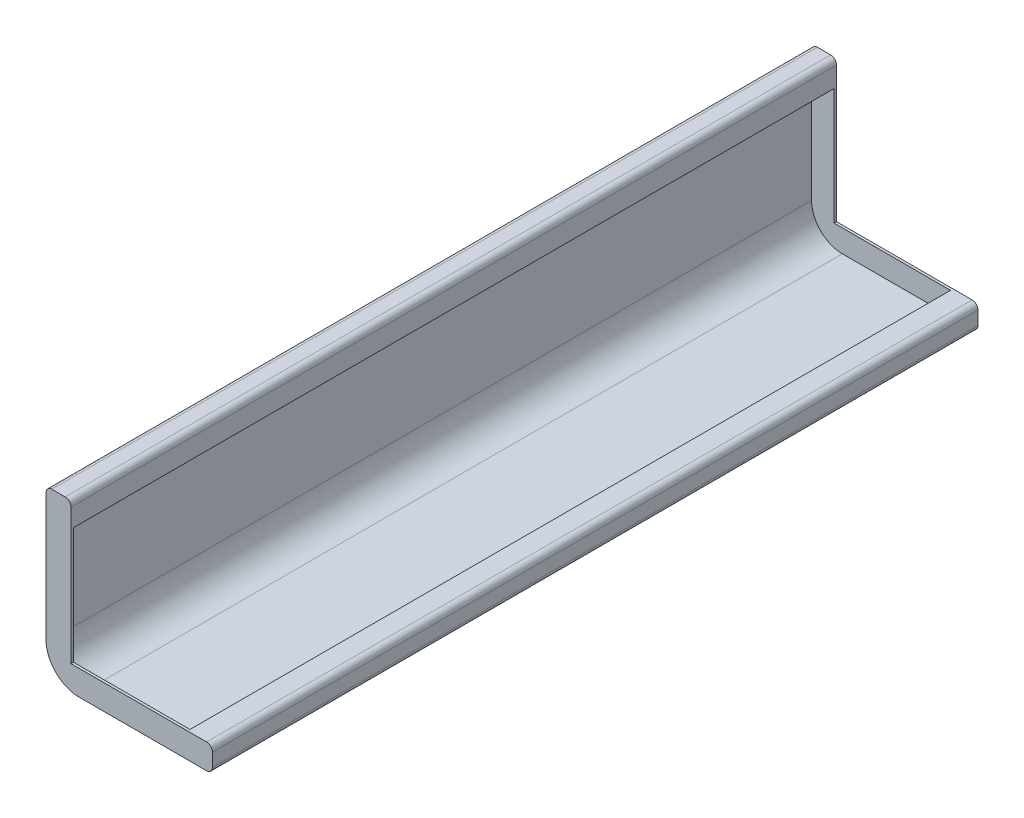
ISO-10303-21;
HEADER;
FILE_DESCRIPTION(('STEP AP214'),'2;1');
FILE_NAME('part.step','',(''),(''),'','','');
FILE_SCHEMA(('AUTOMOTIVE_DESIGN { 1 0 10303 214 1 1 1 1 }'));
ENDSEC;
DATA;
#1=APPLICATION_CONTEXT('core data for automotive mechanical design processes');
#2=APPLICATION_PROTOCOL_DEFINITION('international standard','automotive_design',2000,#1);
#3=PRODUCT_CONTEXT('',#1,'mechanical');
#4=PRODUCT('Part','Part','',(#3));
#5=PRODUCT_RELATED_PRODUCT_CATEGORY('part','',(#4));
#6=PRODUCT_DEFINITION_FORMATION('','',#4);
#7=PRODUCT_DEFINITION_CONTEXT('part definition',#1,'design');
#8=PRODUCT_DEFINITION('design','',#6,#7);
#9=PRODUCT_DEFINITION_SHAPE('','',#8);
#10=(LENGTH_UNIT() NAMED_UNIT(*) SI_UNIT(.MILLI.,.METRE.));
#11=(NAMED_UNIT(*) PLANE_ANGLE_UNIT() SI_UNIT($,.RADIAN.));
#12=(NAMED_UNIT(*) SI_UNIT($,.STERADIAN.) SOLID_ANGLE_UNIT());
#13=UNCERTAINTY_MEASURE_WITH_UNIT(LENGTH_MEASURE(1.E-05),#10,'distance_accuracy_value','');
#14=(GEOMETRIC_REPRESENTATION_CONTEXT(3) GLOBAL_UNCERTAINTY_ASSIGNED_CONTEXT((#13)) GLOBAL_UNIT_ASSIGNED_CONTEXT((#10,
#11,#12)) REPRESENTATION_CONTEXT('',''));
#15=CARTESIAN_POINT('',(0.,0.,0.));
#16=DIRECTION('',(0.,0.,1.));
#17=DIRECTION('',(1.,0.,0.));
#18=AXIS2_PLACEMENT_3D('',#15,#16,#17);
#19=CARTESIAN_POINT('',(-3.08655493139496E-13,98.5000000000002,0.));
#20=DIRECTION('',(0.,-1.,0.));
#21=DIRECTION('',(1.,0.,0.));
#22=AXIS2_PLACEMENT_3D('',#19,#20,#21);
#23=PLANE('',#22);
#24=DIRECTION('',(0.,0.,1.));
#25=VECTOR('',#24,1.);
#26=CARTESIAN_POINT('',(-56.5,98.5,0.));
#27=LINE('',#26,#25);
#28=CARTESIAN_POINT('',(-56.5,98.5,1.5));
#29=VERTEX_POINT('',#28);
#30=CARTESIAN_POINT('',(-56.5,98.5,458.5));
#31=VERTEX_POINT('',#30);
#32=EDGE_CURVE('E433',#29,#31,#27,.T.);
#33=ORIENTED_EDGE('',*,*,#32,.F.);
#34=DIRECTION('',(1.,0.,0.));
#35=VECTOR('',#34,1.);
#36=CARTESIAN_POINT('',(-3.08655493139496E-13,98.5000000000002,1.5));
#37=LINE('',#36,#35);
#38=CARTESIAN_POINT('',(-48.5,98.5,1.5));
#39=VERTEX_POINT('',#38);
#40=EDGE_CURVE('E328',#29,#39,#37,.T.);
#41=ORIENTED_EDGE('',*,*,#40,.T.);
#42=DIRECTION('',(0.,0.,1.));
#43=VECTOR('',#42,1.);
#44=CARTESIAN_POINT('',(-48.5,98.5,460.));
#45=LINE('',#44,#43);
#46=CARTESIAN_POINT('',(-48.5,98.5,458.5));
#47=VERTEX_POINT('',#46);
#48=EDGE_CURVE('E392',#47,#39,#45,.F.);
#49=ORIENTED_EDGE('',*,*,#48,.F.);
#50=DIRECTION('',(-1.,0.,0.));
#51=VECTOR('',#50,1.);
#52=CARTESIAN_POINT('',(-3.08655493139496E-13,98.5000000000002,458.5));
#53=LINE('',#52,#51);
#54=EDGE_CURVE('E363',#47,#31,#53,.T.);
#55=ORIENTED_EDGE('',*,*,#54,.T.);
#56=EDGE_LOOP('',(#33,#41,#49,#55));
#57=FACE_BOUND('',#56,.T.);
#58=ADVANCED_FACE('F119',(#57),#23,.T.);
#59=CARTESIAN_POINT('',(38.5,-1.43917799488446E-13,0.));
#60=DIRECTION('',(-1.,0.,0.));
#61=DIRECTION('',(0.,-1.,0.));
#62=AXIS2_PLACEMENT_3D('',#59,#60,#61);
#63=PLANE('',#62);
#64=DIRECTION('',(0.,0.,-1.));
#65=VECTOR('',#64,1.);
#66=CARTESIAN_POINT('',(38.5,11.5,0.));
#67=LINE('',#66,#65);
#68=CARTESIAN_POINT('',(38.5,11.5,1.5));
#69=VERTEX_POINT('',#68);
#70=CARTESIAN_POINT('',(38.5,11.5,458.5));
#71=VERTEX_POINT('',#70);
#72=EDGE_CURVE('E417',#69,#71,#67,.F.);
#73=ORIENTED_EDGE('',*,*,#72,.F.);
#74=DIRECTION('',(0.,-1.,0.));
#75=VECTOR('',#74,1.);
#76=CARTESIAN_POINT('',(38.5,-1.43917799488446E-13,1.5));
#77=LINE('',#76,#75);
#78=CARTESIAN_POINT('',(38.5,3.50000000000001,1.5));
#79=VERTEX_POINT('',#78);
#80=EDGE_CURVE('E341',#69,#79,#77,.T.);
#81=ORIENTED_EDGE('',*,*,#80,.T.);
#82=DIRECTION('',(0.,0.,-1.));
#83=VECTOR('',#82,1.);
#84=CARTESIAN_POINT('',(38.5,3.5,460.));
#85=LINE('',#84,#83);
#86=CARTESIAN_POINT('',(38.5,3.5,458.5));
#87=VERTEX_POINT('',#86);
#88=EDGE_CURVE('E452',#87,#79,#85,.T.);
#89=ORIENTED_EDGE('',*,*,#88,.F.);
#90=DIRECTION('',(0.,1.,0.));
#91=VECTOR('',#90,1.);
#92=CARTESIAN_POINT('',(38.5,-1.43917799488446E-13,458.5));
#93=LINE('',#92,#91);
#94=EDGE_CURVE('E377',#87,#71,#93,.T.);
#95=ORIENTED_EDGE('',*,*,#94,.T.);
#96=EDGE_LOOP('',(#73,#81,#89,#95));
#97=FACE_BOUND('',#96,.T.);
#98=ADVANCED_FACE('F570',(#97),#63,.T.);
#99=CARTESIAN_POINT('',(-58.5,20.,460.));
#100=DIRECTION('',(-1.,0.,0.));
#101=DIRECTION('',(0.,-1.,0.));
#102=AXIS2_PLACEMENT_3D('',#99,#100,#101);
#103=PLANE('',#102);
#104=DIRECTION('',(0.,-1.,0.));
#105=VECTOR('',#104,1.);
#106=CARTESIAN_POINT('',(-58.5,20.,1.5));
#107=LINE('',#106,#105);
#108=CARTESIAN_POINT('',(-58.5,96.5,1.5));
#109=VERTEX_POINT('',#108);
#110=CARTESIAN_POINT('',(-58.5,20.,1.5));
#111=VERTEX_POINT('',#110);
#112=EDGE_CURVE('E333',#109,#111,#107,.T.);
#113=ORIENTED_EDGE('',*,*,#112,.F.);
#114=DIRECTION('',(0.,0.,1.));
#115=VECTOR('',#114,1.);
#116=CARTESIAN_POINT('',(-58.5,96.5,460.));
#117=LINE('',#116,#115);
#118=CARTESIAN_POINT('',(-58.5,96.5,458.5));
#119=VERTEX_POINT('',#118);
#120=EDGE_CURVE('E440',#119,#109,#117,.F.);
#121=ORIENTED_EDGE('',*,*,#120,.F.);
#122=DIRECTION('',(0.,1.,0.));
#123=VECTOR('',#122,1.);
#124=CARTESIAN_POINT('',(-58.5,20.,458.5));
#125=LINE('',#124,#123);
#126=CARTESIAN_POINT('',(-58.5,20.,458.5));
#127=VERTEX_POINT('',#126);
#128=EDGE_CURVE('E142',#127,#119,#125,.T.);
#129=ORIENTED_EDGE('',*,*,#128,.F.);
#130=DIRECTION('',(0.,0.,-1.));
#131=VECTOR('',#130,1.);
#132=CARTESIAN_POINT('',(-58.5,20.,460.));
#133=LINE('',#132,#131);
#134=EDGE_CURVE('E486',#127,#111,#133,.T.);
#135=ORIENTED_EDGE('',*,*,#134,.T.);
#136=EDGE_LOOP('',(#113,#121,#129,#135));
#137=FACE_BOUND('',#136,.T.);
#138=ADVANCED_FACE('F555',(#137),#103,.F.);
#139=CARTESIAN_POINT('',(-40.,1.5,460.));
#140=DIRECTION('',(0.,-1.,0.));
#141=DIRECTION('',(0.,0.,-1.));
#142=AXIS2_PLACEMENT_3D('',#139,#140,#141);
#143=PLANE('',#142);
#144=DIRECTION('',(1.,0.,0.));
#145=VECTOR('',#144,1.);
#146=CARTESIAN_POINT('',(-40.,1.5,1.5));
#147=LINE('',#146,#145);
#148=CARTESIAN_POINT('',(-40.,1.5,1.5));
#149=VERTEX_POINT('',#148);
#150=CARTESIAN_POINT('',(36.5,1.5,1.5));
#151=VERTEX_POINT('',#150);
#152=EDGE_CURVE('E337',#149,#151,#147,.T.);
#153=ORIENTED_EDGE('',*,*,#152,.F.);
#154=DIRECTION('',(0.,0.,-1.));
#155=VECTOR('',#154,1.);
#156=CARTESIAN_POINT('',(-40.,1.5,460.));
#157=LINE('',#156,#155);
#158=CARTESIAN_POINT('',(-40.,1.5,458.5));
#159=VERTEX_POINT('',#158);
#160=EDGE_CURVE('E495',#159,#149,#157,.T.);
#161=ORIENTED_EDGE('',*,*,#160,.F.);
#162=DIRECTION('',(-1.,0.,0.));
#163=VECTOR('',#162,1.);
#164=CARTESIAN_POINT('',(-40.,1.5,458.5));
#165=LINE('',#164,#163);
#166=CARTESIAN_POINT('',(36.5,1.49999999999998,458.5));
#167=VERTEX_POINT('',#166);
#168=EDGE_CURVE('E371',#167,#159,#165,.T.);
#169=ORIENTED_EDGE('',*,*,#168,.F.);
#170=DIRECTION('',(0.,0.,-1.));
#171=VECTOR('',#170,1.);
#172=CARTESIAN_POINT('',(36.5,1.50000000000003,0.));
#173=LINE('',#172,#171);
#174=EDGE_CURVE('E459',#151,#167,#173,.F.);
#175=ORIENTED_EDGE('',*,*,#174,.F.);
#176=EDGE_LOOP('',(#153,#161,#169,#175));
#177=FACE_BOUND('',#176,.T.);
#178=ADVANCED_FACE('F561',(#177),#143,.F.);
#179=CARTESIAN_POINT('',(-40.,20.,460.));
#180=DIRECTION('',(0.,0.,-1.));
#181=DIRECTION('',(-1.,0.,0.));
#182=AXIS2_PLACEMENT_3D('',#179,#180,#181);
#183=CYLINDRICAL_SURFACE('',#182,18.5);
#184=CARTESIAN_POINT('',(-40.,20.,1.5));
#185=DIRECTION('',(0.,0.,-1.));
#186=DIRECTION('',(-1.,0.,0.));
#187=AXIS2_PLACEMENT_3D('',#184,#185,#186);
#188=CIRCLE('',#187,18.5);
#189=EDGE_CURVE('E335',#111,#149,#188,.F.);
#190=ORIENTED_EDGE('',*,*,#189,.F.);
#191=ORIENTED_EDGE('',*,*,#134,.F.);
#192=CARTESIAN_POINT('',(-40.,20.,458.5));
#193=DIRECTION('',(0.,0.,1.));
#194=DIRECTION('',(1.,0.,0.));
#195=AXIS2_PLACEMENT_3D('',#192,#193,#194);
#196=CIRCLE('',#195,18.5);
#197=EDGE_CURVE('E134',#159,#127,#196,.F.);
#198=ORIENTED_EDGE('',*,*,#197,.F.);
#199=ORIENTED_EDGE('',*,*,#160,.T.);
#200=EDGE_LOOP('',(#190,#191,#198,#199));
#201=FACE_BOUND('',#200,.T.);
#202=ADVANCED_FACE('F558',(#201),#183,.F.);
#203=CARTESIAN_POINT('',(36.5,3.50000000000004,0.));
#204=DIRECTION('',(0.,0.,-1.));
#205=DIRECTION('',(1.,0.,0.));
#206=AXIS2_PLACEMENT_3D('',#203,#204,#205);
#207=CYLINDRICAL_SURFACE('',#206,2.);
#208=CARTESIAN_POINT('',(36.5,3.50000000000004,1.5));
#209=DIRECTION('',(0.,0.,-1.));
#210=DIRECTION('',(-1.,0.,0.));
#211=AXIS2_PLACEMENT_3D('',#208,#209,#210);
#212=CIRCLE('',#211,2.);
#213=EDGE_CURVE('E339',#151,#79,#212,.F.);
#214=ORIENTED_EDGE('',*,*,#213,.F.);
#215=ORIENTED_EDGE('',*,*,#174,.T.);
#216=CARTESIAN_POINT('',(36.5,3.49999999999999,458.5));
#217=DIRECTION('',(0.,0.,1.));
#218=DIRECTION('',(1.,0.,0.));
#219=AXIS2_PLACEMENT_3D('',#216,#217,#218);
#220=CIRCLE('',#219,2.);
#221=EDGE_CURVE('E374',#87,#167,#220,.F.);
#222=ORIENTED_EDGE('',*,*,#221,.F.);
#223=ORIENTED_EDGE('',*,*,#88,.T.);
#224=EDGE_LOOP('',(#214,#215,#222,#223));
#225=FACE_BOUND('',#224,.T.);
#226=ADVANCED_FACE('F567',(#225),#207,.F.);
#227=CARTESIAN_POINT('',(-56.5,96.5,460.));
#228=DIRECTION('',(0.,0.,1.));
#229=DIRECTION('',(0.,1.,0.));
#230=AXIS2_PLACEMENT_3D('',#227,#228,#229);
#231=CYLINDRICAL_SURFACE('',#230,2.);
#232=CARTESIAN_POINT('',(-56.5,96.5,1.5));
#233=DIRECTION('',(0.,0.,-1.));
#234=DIRECTION('',(-1.,0.,0.));
#235=AXIS2_PLACEMENT_3D('',#232,#233,#234);
#236=CIRCLE('',#235,2.);
#237=EDGE_CURVE('E331',#29,#109,#236,.F.);
#238=ORIENTED_EDGE('',*,*,#237,.F.);
#239=ORIENTED_EDGE('',*,*,#32,.T.);
#240=CARTESIAN_POINT('',(-56.5,96.5,458.5));
#241=DIRECTION('',(0.,0.,1.));
#242=DIRECTION('',(1.,0.,0.));
#243=AXIS2_PLACEMENT_3D('',#240,#241,#242);
#244=CIRCLE('',#243,2.);
#245=EDGE_CURVE('E366',#119,#31,#244,.F.);
#246=ORIENTED_EDGE('',*,*,#245,.F.);
#247=ORIENTED_EDGE('',*,*,#120,.T.);
#248=EDGE_LOOP('',(#238,#239,#246,#247));
#249=FACE_BOUND('',#248,.T.);
#250=ADVANCED_FACE('F553',(#249),#231,.F.);
#251=CARTESIAN_POINT('',(36.5,11.5,0.));
#252=DIRECTION('',(0.,0.,-1.));
#253=DIRECTION('',(0.,1.,0.));
#254=AXIS2_PLACEMENT_3D('',#251,#252,#253);
#255=CYLINDRICAL_SURFACE('',#254,2.);
#256=CARTESIAN_POINT('',(36.5,11.5,1.5));
#257=DIRECTION('',(0.,0.,-1.));
#258=DIRECTION('',(-1.,0.,0.));
#259=AXIS2_PLACEMENT_3D('',#256,#257,#258);
#260=CIRCLE('',#259,2.);
#261=CARTESIAN_POINT('',(36.5,13.5,1.5));
#262=VERTEX_POINT('',#261);
#263=EDGE_CURVE('E344',#69,#262,#260,.F.);
#264=ORIENTED_EDGE('',*,*,#263,.F.);
#265=ORIENTED_EDGE('',*,*,#72,.T.);
#266=CARTESIAN_POINT('',(36.5,11.5,458.5));
#267=DIRECTION('',(0.,0.,1.));
#268=DIRECTION('',(1.,0.,0.));
#269=AXIS2_PLACEMENT_3D('',#266,#267,#268);
#270=CIRCLE('',#269,2.);
#271=CARTESIAN_POINT('',(36.5,13.5,458.5));
#272=VERTEX_POINT('',#271);
#273=EDGE_CURVE('E380',#272,#71,#270,.F.);
#274=ORIENTED_EDGE('',*,*,#273,.F.);
#275=DIRECTION('',(0.,0.,-1.));
#276=VECTOR('',#275,1.);
#277=CARTESIAN_POINT('',(36.5,13.5,460.));
#278=LINE('',#277,#276);
#279=EDGE_CURVE('E409',#272,#262,#278,.T.);
#280=ORIENTED_EDGE('',*,*,#279,.T.);
#281=EDGE_LOOP('',(#264,#265,#274,#280));
#282=FACE_BOUND('',#281,.T.);
#283=ADVANCED_FACE('F573',(#282),#255,.F.);
#284=CARTESIAN_POINT('',(1.00613961606657E-13,13.5000000000003,0.));
#285=DIRECTION('',(0.,-1.,0.));
#286=DIRECTION('',(1.,0.,0.));
#287=AXIS2_PLACEMENT_3D('',#284,#285,#286);
#288=PLANE('',#287);
#289=DIRECTION('',(0.,0.,-1.));
#290=VECTOR('',#289,1.);
#291=CARTESIAN_POINT('',(25.,13.5000000000001,460.));
#292=LINE('',#291,#290);
#293=CARTESIAN_POINT('',(25.,13.5000000000001,1.5));
#294=VERTEX_POINT('',#293);
#295=CARTESIAN_POINT('',(25.,13.5000000000001,458.5));
#296=VERTEX_POINT('',#295);
#297=EDGE_CURVE('E421',#294,#296,#292,.F.);
#298=ORIENTED_EDGE('',*,*,#297,.F.);
#299=DIRECTION('',(1.,0.,0.));
#300=VECTOR('',#299,1.);
#301=CARTESIAN_POINT('',(1.00613961606657E-13,13.5000000000003,1.5));
#302=LINE('',#301,#300);
#303=EDGE_CURVE('E346',#294,#262,#302,.T.);
#304=ORIENTED_EDGE('',*,*,#303,.T.);
#305=ORIENTED_EDGE('',*,*,#279,.F.);
#306=DIRECTION('',(-1.,0.,0.));
#307=VECTOR('',#306,1.);
#308=CARTESIAN_POINT('',(1.00613961606657E-13,13.5000000000003,458.5));
#309=LINE('',#308,#307);
#310=EDGE_CURVE('E383',#272,#296,#309,.T.);
#311=ORIENTED_EDGE('',*,*,#310,.T.);
#312=EDGE_LOOP('',(#298,#304,#305,#311));
#313=FACE_BOUND('',#312,.T.);
#314=ADVANCED_FACE('F578',(#313),#288,.T.);
#315=CARTESIAN_POINT('',(25.,15.0000000000001,460.));
#316=DIRECTION('',(1.,0.,0.));
#317=DIRECTION('',(0.,1.,0.));
#318=AXIS2_PLACEMENT_3D('',#315,#316,#317);
#319=PLANE('',#318);
#320=DIRECTION('',(0.,1.,0.));
#321=VECTOR('',#320,1.);
#322=CARTESIAN_POINT('',(25.,15.0000000000001,1.5));
#323=LINE('',#322,#321);
#324=CARTESIAN_POINT('',(25.,15.0000000000001,1.5));
#325=VERTEX_POINT('',#324);
#326=EDGE_CURVE('E310',#294,#325,#323,.T.);
#327=ORIENTED_EDGE('',*,*,#326,.F.);
#328=ORIENTED_EDGE('',*,*,#297,.T.);
#329=DIRECTION('',(0.,-1.,0.));
#330=VECTOR('',#329,1.);
#331=CARTESIAN_POINT('',(25.,15.0000000000001,458.5));
#332=LINE('',#331,#330);
#333=CARTESIAN_POINT('',(25.,15.0000000000001,458.5));
#334=VERTEX_POINT('',#333);
#335=EDGE_CURVE('E386',#334,#296,#332,.T.);
#336=ORIENTED_EDGE('',*,*,#335,.F.);
#337=DIRECTION('',(0.,0.,1.));
#338=VECTOR('',#337,1.);
#339=CARTESIAN_POINT('',(25.,15.0000000000001,0.));
#340=LINE('',#339,#338);
#341=EDGE_CURVE('E418',#325,#334,#340,.T.);
#342=ORIENTED_EDGE('',*,*,#341,.F.);
#343=EDGE_LOOP('',(#327,#328,#336,#342));
#344=FACE_BOUND('',#343,.T.);
#345=ADVANCED_FACE('F581',(#344),#319,.F.);
#346=CARTESIAN_POINT('',(-48.5,96.5,460.));
#347=DIRECTION('',(0.,0.,1.));
#348=DIRECTION('',(1.,0.,0.));
#349=AXIS2_PLACEMENT_3D('',#346,#347,#348);
#350=CYLINDRICAL_SURFACE('',#349,2.);
#351=CARTESIAN_POINT('',(-48.5,96.5,1.5));
#352=DIRECTION('',(0.,0.,-1.));
#353=DIRECTION('',(-1.,0.,0.));
#354=AXIS2_PLACEMENT_3D('',#351,#352,#353);
#355=CIRCLE('',#354,2.);
#356=CARTESIAN_POINT('',(-46.5,96.5,1.5));
#357=VERTEX_POINT('',#356);
#358=EDGE_CURVE('E326',#357,#39,#355,.F.);
#359=ORIENTED_EDGE('',*,*,#358,.F.);
#360=DIRECTION('',(0.,0.,1.));
#361=VECTOR('',#360,1.);
#362=CARTESIAN_POINT('',(-46.5,96.5,0.));
#363=LINE('',#362,#361);
#364=CARTESIAN_POINT('',(-46.5,96.5,458.5));
#365=VERTEX_POINT('',#364);
#366=EDGE_CURVE('E389',#357,#365,#363,.T.);
#367=ORIENTED_EDGE('',*,*,#366,.T.);
#368=CARTESIAN_POINT('',(-48.5,96.5,458.5));
#369=DIRECTION('',(0.,0.,1.));
#370=DIRECTION('',(1.,0.,0.));
#371=AXIS2_PLACEMENT_3D('',#368,#369,#370);
#372=CIRCLE('',#371,2.);
#373=EDGE_CURVE('E360',#47,#365,#372,.F.);
#374=ORIENTED_EDGE('',*,*,#373,.F.);
#375=ORIENTED_EDGE('',*,*,#48,.T.);
#376=EDGE_LOOP('',(#359,#367,#374,#375));
#377=FACE_BOUND('',#376,.T.);
#378=ADVANCED_FACE('F546',(#377),#350,.F.);
#379=CARTESIAN_POINT('',(-46.4999999999993,-3.05311331771914E-13,0.));
#380=DIRECTION('',(-1.,0.,0.));
#381=DIRECTION('',(0.,-1.,0.));
#382=AXIS2_PLACEMENT_3D('',#379,#380,#381);
#383=PLANE('',#382);
#384=ORIENTED_EDGE('',*,*,#366,.F.);
#385=DIRECTION('',(0.,-1.,0.));
#386=VECTOR('',#385,1.);
#387=CARTESIAN_POINT('',(-46.4999999999993,-3.05311331771914E-13,1.5));
#388=LINE('',#387,#386);
#389=CARTESIAN_POINT('',(-46.4999999999999,85.,1.5));
#390=VERTEX_POINT('',#389);
#391=EDGE_CURVE('E321',#357,#390,#388,.T.);
#392=ORIENTED_EDGE('',*,*,#391,.T.);
#393=DIRECTION('',(0.,0.,1.));
#394=VECTOR('',#393,1.);
#395=CARTESIAN_POINT('',(-46.4999999999999,85.,0.));
#396=LINE('',#395,#394);
#397=CARTESIAN_POINT('',(-46.4999999999999,85.,458.5));
#398=VERTEX_POINT('',#397);
#399=EDGE_CURVE('E397',#398,#390,#396,.F.);
#400=ORIENTED_EDGE('',*,*,#399,.F.);
#401=DIRECTION('',(0.,1.,0.));
#402=VECTOR('',#401,1.);
#403=CARTESIAN_POINT('',(-46.4999999999993,-3.05311331771914E-13,458.5));
#404=LINE('',#403,#402);
#405=EDGE_CURVE('E357',#398,#365,#404,.T.);
#406=ORIENTED_EDGE('',*,*,#405,.T.);
#407=EDGE_LOOP('',(#384,#392,#400,#406));
#408=FACE_BOUND('',#407,.T.);
#409=ADVANCED_FACE('F543',(#408),#383,.T.);
#410=CARTESIAN_POINT('',(-44.9999999999999,85.0000000000001,0.));
#411=DIRECTION('',(0.,1.,0.));
#412=DIRECTION('',(-1.,0.,0.));
#413=AXIS2_PLACEMENT_3D('',#410,#411,#412);
#414=PLANE('',#413);
#415=DIRECTION('',(-1.,0.,0.));
#416=VECTOR('',#415,1.);
#417=CARTESIAN_POINT('',(-44.9999999999999,85.0000000000001,1.5));
#418=LINE('',#417,#416);
#419=CARTESIAN_POINT('',(-44.9999999999999,85.0000000000001,1.5));
#420=VERTEX_POINT('',#419);
#421=EDGE_CURVE('E319',#420,#390,#418,.T.);
#422=ORIENTED_EDGE('',*,*,#421,.F.);
#423=DIRECTION('',(0.,0.,-1.));
#424=VECTOR('',#423,1.);
#425=CARTESIAN_POINT('',(-44.9999999999999,85.0000000000001,0.));
#426=LINE('',#425,#424);
#427=CARTESIAN_POINT('',(-44.9999999999999,85.0000000000001,458.5));
#428=VERTEX_POINT('',#427);
#429=EDGE_CURVE('E302',#428,#420,#426,.T.);
#430=ORIENTED_EDGE('',*,*,#429,.F.);
#431=DIRECTION('',(1.,0.,0.));
#432=VECTOR('',#431,1.);
#433=CARTESIAN_POINT('',(-44.9999999999999,85.0000000000001,458.5));
#434=LINE('',#433,#432);
#435=EDGE_CURVE('E13',#398,#428,#434,.T.);
#436=ORIENTED_EDGE('',*,*,#435,.F.);
#437=ORIENTED_EDGE('',*,*,#399,.T.);
#438=EDGE_LOOP('',(#422,#430,#436,#437));
#439=FACE_BOUND('',#438,.T.);
#440=ADVANCED_FACE('F540',(#439),#414,.F.);
#441=CARTESIAN_POINT('',(-3.13632506626364E-13,100.,0.));
#442=DIRECTION('',(0.,-1.,0.));
#443=DIRECTION('',(1.,0.,0.));
#444=AXIS2_PLACEMENT_3D('',#441,#442,#443);
#445=PLANE('',#444);
#446=DIRECTION('',(-1.,0.,0.));
#447=VECTOR('',#446,1.);
#448=CARTESIAN_POINT('',(-3.13632506626364E-13,100.,0.));
#449=LINE('',#448,#447);
#450=CARTESIAN_POINT('',(-48.5,100.,0.));
#451=VERTEX_POINT('',#450);
#452=CARTESIAN_POINT('',(-56.5,100.,0.));
#453=VERTEX_POINT('',#452);
#454=EDGE_CURVE('E437',#451,#453,#449,.T.);
#455=ORIENTED_EDGE('',*,*,#454,.T.);
#456=DIRECTION('',(0.,0.,1.));
#457=VECTOR('',#456,1.);
#458=CARTESIAN_POINT('',(-56.5,100.,0.));
#459=LINE('',#458,#457);
#460=CARTESIAN_POINT('',(-56.5,100.,460.));
#461=VERTEX_POINT('',#460);
#462=EDGE_CURVE('E443',#461,#453,#459,.F.);
#463=ORIENTED_EDGE('',*,*,#462,.F.);
#464=DIRECTION('',(1.,0.,0.));
#465=VECTOR('',#464,1.);
#466=CARTESIAN_POINT('',(-3.13632506626364E-13,100.,460.));
#467=LINE('',#466,#465);
#468=CARTESIAN_POINT('',(-48.5,100.,460.));
#469=VERTEX_POINT('',#468);
#470=EDGE_CURVE('E441',#461,#469,#467,.T.);
#471=ORIENTED_EDGE('',*,*,#470,.T.);
#472=DIRECTION('',(0.,0.,1.));
#473=VECTOR('',#472,1.);
#474=CARTESIAN_POINT('',(-48.5,100.,460.));
#475=LINE('',#474,#473);
#476=EDGE_CURVE('E403',#469,#451,#475,.F.);
#477=ORIENTED_EDGE('',*,*,#476,.T.);
#478=EDGE_LOOP('',(#455,#463,#471,#477));
#479=FACE_BOUND('',#478,.T.);
#480=ADVANCED_FACE('F522',(#479),#445,.F.);
#481=CARTESIAN_POINT('',(40.,-1.49155021496711E-13,0.));
#482=DIRECTION('',(-1.,0.,0.));
#483=DIRECTION('',(0.,-1.,0.));
#484=AXIS2_PLACEMENT_3D('',#481,#482,#483);
#485=PLANE('',#484);
#486=DIRECTION('',(0.,0.,-1.));
#487=VECTOR('',#486,1.);
#488=CARTESIAN_POINT('',(40.,11.5,0.));
#489=LINE('',#488,#487);
#490=CARTESIAN_POINT('',(40.,11.5,0.));
#491=VERTEX_POINT('',#490);
#492=CARTESIAN_POINT('',(40.,11.5,460.));
#493=VERTEX_POINT('',#492);
#494=EDGE_CURVE('E427',#491,#493,#489,.F.);
#495=ORIENTED_EDGE('',*,*,#494,.T.);
#496=DIRECTION('',(0.,-1.,0.));
#497=VECTOR('',#496,1.);
#498=CARTESIAN_POINT('',(40.,-1.49155021496711E-13,460.));
#499=LINE('',#498,#497);
#500=CARTESIAN_POINT('',(40.,3.49999999999997,460.));
#501=VERTEX_POINT('',#500);
#502=EDGE_CURVE('E460',#493,#501,#499,.T.);
#503=ORIENTED_EDGE('',*,*,#502,.T.);
#504=DIRECTION('',(0.,0.,-1.));
#505=VECTOR('',#504,1.);
#506=CARTESIAN_POINT('',(40.,3.49999999999999,460.));
#507=LINE('',#506,#505);
#508=CARTESIAN_POINT('',(40.,3.5,0.));
#509=VERTEX_POINT('',#508);
#510=EDGE_CURVE('E463',#509,#501,#507,.F.);
#511=ORIENTED_EDGE('',*,*,#510,.F.);
#512=DIRECTION('',(0.,1.,0.));
#513=VECTOR('',#512,1.);
#514=CARTESIAN_POINT('',(40.,-1.49155021496711E-13,0.));
#515=LINE('',#514,#513);
#516=EDGE_CURVE('E457',#509,#491,#515,.T.);
#517=ORIENTED_EDGE('',*,*,#516,.T.);
#518=EDGE_LOOP('',(#495,#503,#511,#517));
#519=FACE_BOUND('',#518,.T.);
#520=ADVANCED_FACE('F606',(#519),#485,.F.);
#521=CARTESIAN_POINT('',(-60.,20.,460.));
#522=DIRECTION('',(-1.,0.,0.));
#523=DIRECTION('',(0.,-1.,0.));
#524=AXIS2_PLACEMENT_3D('',#521,#522,#523);
#525=PLANE('',#524);
#526=DIRECTION('',(0.,1.,0.));
#527=VECTOR('',#526,1.);
#528=CARTESIAN_POINT('',(-60.,20.,0.));
#529=LINE('',#528,#527);
#530=CARTESIAN_POINT('',(-60.,20.,0.));
#531=VERTEX_POINT('',#530);
#532=CARTESIAN_POINT('',(-60.,96.5,0.));
#533=VERTEX_POINT('',#532);
#534=EDGE_CURVE('E473',#531,#533,#529,.T.);
#535=ORIENTED_EDGE('',*,*,#534,.F.);
#536=DIRECTION('',(0.,0.,-1.));
#537=VECTOR('',#536,1.);
#538=CARTESIAN_POINT('',(-60.,20.,460.));
#539=LINE('',#538,#537);
#540=CARTESIAN_POINT('',(-60.,20.,460.));
#541=VERTEX_POINT('',#540);
#542=EDGE_CURVE('E127',#541,#531,#539,.T.);
#543=ORIENTED_EDGE('',*,*,#542,.F.);
#544=DIRECTION('',(0.,1.,0.));
#545=VECTOR('',#544,1.);
#546=CARTESIAN_POINT('',(-60.,20.,460.));
#547=LINE('',#546,#545);
#548=CARTESIAN_POINT('',(-60.,96.5,460.));
#549=VERTEX_POINT('',#548);
#550=EDGE_CURVE('E477',#541,#549,#547,.T.);
#551=ORIENTED_EDGE('',*,*,#550,.T.);
#552=DIRECTION('',(0.,0.,1.));
#553=VECTOR('',#552,1.);
#554=CARTESIAN_POINT('',(-60.,96.5,460.));
#555=LINE('',#554,#553);
#556=EDGE_CURVE('E446',#549,#533,#555,.F.);
#557=ORIENTED_EDGE('',*,*,#556,.T.);
#558=EDGE_LOOP('',(#535,#543,#551,#557));
#559=FACE_BOUND('',#558,.T.);
#560=ADVANCED_FACE('F506',(#559),#525,.T.);
#561=CARTESIAN_POINT('',(-40.,0.,460.));
#562=DIRECTION('',(0.,-1.,0.));
#563=DIRECTION('',(0.,0.,-1.));
#564=AXIS2_PLACEMENT_3D('',#561,#562,#563);
#565=PLANE('',#564);
#566=DIRECTION('',(0.,0.,-1.));
#567=VECTOR('',#566,1.);
#568=CARTESIAN_POINT('',(36.5,0.,0.));
#569=LINE('',#568,#567);
#570=CARTESIAN_POINT('',(36.5,0.,0.));
#571=VERTEX_POINT('',#570);
#572=CARTESIAN_POINT('',(36.5,0.,460.));
#573=VERTEX_POINT('',#572);
#574=EDGE_CURVE('E467',#571,#573,#569,.F.);
#575=ORIENTED_EDGE('',*,*,#574,.T.);
#576=DIRECTION('',(-1.,0.,0.));
#577=VECTOR('',#576,1.);
#578=CARTESIAN_POINT('',(-40.,0.,460.));
#579=LINE('',#578,#577);
#580=CARTESIAN_POINT('',(-40.,0.,460.));
#581=VERTEX_POINT('',#580);
#582=EDGE_CURVE('E484',#573,#581,#579,.T.);
#583=ORIENTED_EDGE('',*,*,#582,.T.);
#584=DIRECTION('',(0.,0.,-1.));
#585=VECTOR('',#584,1.);
#586=CARTESIAN_POINT('',(-40.,0.,460.));
#587=LINE('',#586,#585);
#588=CARTESIAN_POINT('',(-40.,0.,0.));
#589=VERTEX_POINT('',#588);
#590=EDGE_CURVE('E497',#581,#589,#587,.T.);
#591=ORIENTED_EDGE('',*,*,#590,.T.);
#592=DIRECTION('',(-1.,0.,0.));
#593=VECTOR('',#592,1.);
#594=CARTESIAN_POINT('',(-40.,0.,0.));
#595=LINE('',#594,#593);
#596=EDGE_CURVE('E481',#571,#589,#595,.T.);
#597=ORIENTED_EDGE('',*,*,#596,.F.);
#598=EDGE_LOOP('',(#575,#583,#591,#597));
#599=FACE_BOUND('',#598,.T.);
#600=ADVANCED_FACE('F513',(#599),#565,.T.);
#601=CARTESIAN_POINT('',(-60.,20.,460.));
#602=DIRECTION('',(0.,0.,1.));
#603=DIRECTION('',(1.,0.,0.));
#604=AXIS2_PLACEMENT_3D('',#601,#602,#603);
#605=PLANE('',#604);
#606=CARTESIAN_POINT('',(-40.,20.,460.));
#607=DIRECTION('',(0.,0.,-1.));
#608=DIRECTION('',(-1.,0.,0.));
#609=AXIS2_PLACEMENT_3D('',#606,#607,#608);
#610=CIRCLE('',#609,20.);
#611=EDGE_CURVE('E480',#581,#541,#610,.T.);
#612=ORIENTED_EDGE('',*,*,#611,.F.);
#613=ORIENTED_EDGE('',*,*,#582,.F.);
#614=CARTESIAN_POINT('',(36.5,3.49999999999999,460.));
#615=DIRECTION('',(0.,0.,-1.));
#616=DIRECTION('',(0.,1.,0.));
#617=AXIS2_PLACEMENT_3D('',#614,#615,#616);
#618=CIRCLE('',#617,3.5);
#619=EDGE_CURVE('E469',#573,#501,#618,.F.);
#620=ORIENTED_EDGE('',*,*,#619,.T.);
#621=ORIENTED_EDGE('',*,*,#502,.F.);
#622=CARTESIAN_POINT('',(36.5,11.5,460.));
#623=DIRECTION('',(0.,0.,-1.));
#624=DIRECTION('',(-1.,0.,0.));
#625=AXIS2_PLACEMENT_3D('',#622,#623,#624);
#626=CIRCLE('',#625,3.5);
#627=CARTESIAN_POINT('',(36.5000000000001,15.,460.));
#628=VERTEX_POINT('',#627);
#629=EDGE_CURVE('E429',#493,#628,#626,.F.);
#630=ORIENTED_EDGE('',*,*,#629,.T.);
#631=DIRECTION('',(1.,0.,0.));
#632=VECTOR('',#631,1.);
#633=CARTESIAN_POINT('',(1.11248101095738E-13,15.0000000000003,460.));
#634=LINE('',#633,#632);
#635=CARTESIAN_POINT('',(-45.,15.,460.));
#636=VERTEX_POINT('',#635);
#637=EDGE_CURVE('E414',#636,#628,#634,.T.);
#638=ORIENTED_EDGE('',*,*,#637,.F.);
#639=DIRECTION('',(0.,-1.,0.));
#640=VECTOR('',#639,1.);
#641=CARTESIAN_POINT('',(-44.9999999999993,-2.95448180494377E-13,460.));
#642=LINE('',#641,#640);
#643=CARTESIAN_POINT('',(-45.,96.5,460.));
#644=VERTEX_POINT('',#643);
#645=EDGE_CURVE('E394',#644,#636,#642,.T.);
#646=ORIENTED_EDGE('',*,*,#645,.F.);
#647=CARTESIAN_POINT('',(-48.5,96.5,460.));
#648=DIRECTION('',(0.,0.,1.));
#649=DIRECTION('',(1.,0.,0.));
#650=AXIS2_PLACEMENT_3D('',#647,#648,#649);
#651=CIRCLE('',#650,3.5);
#652=EDGE_CURVE('E406',#644,#469,#651,.T.);
#653=ORIENTED_EDGE('',*,*,#652,.T.);
#654=ORIENTED_EDGE('',*,*,#470,.F.);
#655=CARTESIAN_POINT('',(-56.5,96.5,460.));
#656=DIRECTION('',(0.,0.,1.));
#657=DIRECTION('',(1.,0.,0.));
#658=AXIS2_PLACEMENT_3D('',#655,#656,#657);
#659=CIRCLE('',#658,3.5);
#660=EDGE_CURVE('E449',#461,#549,#659,.T.);
#661=ORIENTED_EDGE('',*,*,#660,.T.);
#662=ORIENTED_EDGE('',*,*,#550,.F.);
#663=EDGE_LOOP('',(#612,#613,#620,#621,#630,#638,#646,#653,#654,#661,#662));
#664=FACE_BOUND('',#663,.T.);
#665=ADVANCED_FACE('F121',(#664),#605,.T.);
#666=CARTESIAN_POINT('',(-40.,20.,460.));
#667=DIRECTION('',(0.,0.,-1.));
#668=DIRECTION('',(-1.,0.,0.));
#669=AXIS2_PLACEMENT_3D('',#666,#667,#668);
#670=CYLINDRICAL_SURFACE('',#669,20.);
#671=CARTESIAN_POINT('',(-40.,20.,0.));
#672=DIRECTION('',(0.,0.,-1.));
#673=DIRECTION('',(-1.,0.,0.));
#674=AXIS2_PLACEMENT_3D('',#671,#672,#673);
#675=CIRCLE('',#674,20.);
#676=EDGE_CURVE('E489',#589,#531,#675,.T.);
#677=ORIENTED_EDGE('',*,*,#676,.F.);
#678=ORIENTED_EDGE('',*,*,#590,.F.);
#679=ORIENTED_EDGE('',*,*,#611,.T.);
#680=ORIENTED_EDGE('',*,*,#542,.T.);
#681=EDGE_LOOP('',(#677,#678,#679,#680));
#682=FACE_BOUND('',#681,.T.);
#683=ADVANCED_FACE('F501',(#682),#670,.T.);
#684=CARTESIAN_POINT('',(-40.,20.,0.));
#685=DIRECTION('',(0.,0.,-1.));
#686=DIRECTION('',(-1.,0.,0.));
#687=AXIS2_PLACEMENT_3D('',#684,#685,#686);
#688=PLANE('',#687);
#689=ORIENTED_EDGE('',*,*,#676,.T.);
#690=ORIENTED_EDGE('',*,*,#534,.T.);
#691=CARTESIAN_POINT('',(-56.5,96.5,0.));
#692=DIRECTION('',(0.,0.,1.));
#693=DIRECTION('',(1.,0.,0.));
#694=AXIS2_PLACEMENT_3D('',#691,#692,#693);
#695=CIRCLE('',#694,3.5);
#696=EDGE_CURVE('E448',#533,#453,#695,.F.);
#697=ORIENTED_EDGE('',*,*,#696,.T.);
#698=ORIENTED_EDGE('',*,*,#454,.F.);
#699=CARTESIAN_POINT('',(-48.5,96.5,0.));
#700=DIRECTION('',(0.,0.,1.));
#701=DIRECTION('',(1.,0.,0.));
#702=AXIS2_PLACEMENT_3D('',#699,#700,#701);
#703=CIRCLE('',#702,3.5);
#704=CARTESIAN_POINT('',(-45.,96.5,0.));
#705=VERTEX_POINT('',#704);
#706=EDGE_CURVE('E405',#451,#705,#703,.F.);
#707=ORIENTED_EDGE('',*,*,#706,.T.);
#708=DIRECTION('',(0.,1.,0.));
#709=VECTOR('',#708,1.);
#710=CARTESIAN_POINT('',(-44.9999999999993,-2.95448180494377E-13,0.));
#711=LINE('',#710,#709);
#712=CARTESIAN_POINT('',(-45.,15.,0.));
#713=VERTEX_POINT('',#712);
#714=EDGE_CURVE('E390',#713,#705,#711,.T.);
#715=ORIENTED_EDGE('',*,*,#714,.F.);
#716=DIRECTION('',(-1.,0.,0.));
#717=VECTOR('',#716,1.);
#718=CARTESIAN_POINT('',(1.11248101095738E-13,15.0000000000003,0.));
#719=LINE('',#718,#717);
#720=CARTESIAN_POINT('',(36.5000000000001,15.,0.));
#721=VERTEX_POINT('',#720);
#722=EDGE_CURVE('E317',#721,#713,#719,.T.);
#723=ORIENTED_EDGE('',*,*,#722,.F.);
#724=CARTESIAN_POINT('',(36.5,11.5,0.));
#725=DIRECTION('',(0.,0.,-1.));
#726=DIRECTION('',(-1.,0.,0.));
#727=AXIS2_PLACEMENT_3D('',#724,#725,#726);
#728=CIRCLE('',#727,3.5);
#729=EDGE_CURVE('E430',#721,#491,#728,.T.);
#730=ORIENTED_EDGE('',*,*,#729,.T.);
#731=ORIENTED_EDGE('',*,*,#516,.F.);
#732=CARTESIAN_POINT('',(36.5,3.50000000000004,0.));
#733=DIRECTION('',(0.,0.,-1.));
#734=DIRECTION('',(0.,1.,0.));
#735=AXIS2_PLACEMENT_3D('',#732,#733,#734);
#736=CIRCLE('',#735,3.5);
#737=EDGE_CURVE('E470',#509,#571,#736,.T.);
#738=ORIENTED_EDGE('',*,*,#737,.T.);
#739=ORIENTED_EDGE('',*,*,#596,.T.);
#740=EDGE_LOOP('',(#689,#690,#697,#698,#707,#715,#723,#730,#731,#738,#739));
#741=FACE_BOUND('',#740,.T.);
#742=ADVANCED_FACE('F509',(#741),#688,.T.);
#743=CARTESIAN_POINT('',(36.5,3.50000000000004,0.));
#744=DIRECTION('',(0.,0.,-1.));
#745=DIRECTION('',(1.,0.,0.));
#746=AXIS2_PLACEMENT_3D('',#743,#744,#745);
#747=CYLINDRICAL_SURFACE('',#746,3.5);
#748=ORIENTED_EDGE('',*,*,#510,.T.);
#749=ORIENTED_EDGE('',*,*,#619,.F.);
#750=ORIENTED_EDGE('',*,*,#574,.F.);
#751=ORIENTED_EDGE('',*,*,#737,.F.);
#752=EDGE_LOOP('',(#748,#749,#750,#751));
#753=FACE_BOUND('',#752,.T.);
#754=ADVANCED_FACE('F603',(#753),#747,.T.);
#755=CARTESIAN_POINT('',(-56.5,96.5,460.));
#756=DIRECTION('',(0.,0.,1.));
#757=DIRECTION('',(0.,1.,0.));
#758=AXIS2_PLACEMENT_3D('',#755,#756,#757);
#759=CYLINDRICAL_SURFACE('',#758,3.5);
#760=ORIENTED_EDGE('',*,*,#696,.F.);
#761=ORIENTED_EDGE('',*,*,#556,.F.);
#762=ORIENTED_EDGE('',*,*,#660,.F.);
#763=ORIENTED_EDGE('',*,*,#462,.T.);
#764=EDGE_LOOP('',(#760,#761,#762,#763));
#765=FACE_BOUND('',#764,.T.);
#766=ADVANCED_FACE('F520',(#765),#759,.T.);
#767=CARTESIAN_POINT('',(36.5,11.5,0.));
#768=DIRECTION('',(0.,0.,-1.));
#769=DIRECTION('',(0.,1.,0.));
#770=AXIS2_PLACEMENT_3D('',#767,#768,#769);
#771=CYLINDRICAL_SURFACE('',#770,3.5);
#772=DIRECTION('',(0.,0.,-1.));
#773=VECTOR('',#772,1.);
#774=CARTESIAN_POINT('',(36.5000000000001,15.,460.));
#775=LINE('',#774,#773);
#776=EDGE_CURVE('E423',#721,#628,#775,.F.);
#777=ORIENTED_EDGE('',*,*,#776,.T.);
#778=ORIENTED_EDGE('',*,*,#629,.F.);
#779=ORIENTED_EDGE('',*,*,#494,.F.);
#780=ORIENTED_EDGE('',*,*,#729,.F.);
#781=EDGE_LOOP('',(#777,#778,#779,#780));
#782=FACE_BOUND('',#781,.T.);
#783=ADVANCED_FACE('F602',(#782),#771,.T.);
#784=CARTESIAN_POINT('',(1.11248101095738E-13,15.0000000000003,0.));
#785=DIRECTION('',(0.,-1.,0.));
#786=DIRECTION('',(1.,0.,0.));
#787=AXIS2_PLACEMENT_3D('',#784,#785,#786);
#788=PLANE('',#787);
#789=ORIENTED_EDGE('',*,*,#722,.T.);
#790=DIRECTION('',(0.,0.,-1.));
#791=VECTOR('',#790,1.);
#792=CARTESIAN_POINT('',(-45.,15.,1.5));
#793=LINE('',#792,#791);
#794=CARTESIAN_POINT('',(-45.,15.,1.5));
#795=VERTEX_POINT('',#794);
#796=EDGE_CURVE('E300',#795,#713,#793,.T.);
#797=ORIENTED_EDGE('',*,*,#796,.F.);
#798=DIRECTION('',(1.,0.,0.));
#799=VECTOR('',#798,1.);
#800=CARTESIAN_POINT('',(36.5000000000001,15.,1.5));
#801=LINE('',#800,#799);
#802=EDGE_CURVE('E305',#795,#325,#801,.T.);
#803=ORIENTED_EDGE('',*,*,#802,.T.);
#804=ORIENTED_EDGE('',*,*,#341,.T.);
#805=DIRECTION('',(-1.,0.,0.));
#806=VECTOR('',#805,1.);
#807=CARTESIAN_POINT('',(25.,15.0000000000001,458.5));
#808=LINE('',#807,#806);
#809=CARTESIAN_POINT('',(-45.,15.,458.5));
#810=VERTEX_POINT('',#809);
#811=EDGE_CURVE('E350',#334,#810,#808,.T.);
#812=ORIENTED_EDGE('',*,*,#811,.T.);
#813=DIRECTION('',(0.,0.,1.));
#814=VECTOR('',#813,1.);
#815=CARTESIAN_POINT('',(-45.,15.,458.5));
#816=LINE('',#815,#814);
#817=EDGE_CURVE('E354',#810,#636,#816,.T.);
#818=ORIENTED_EDGE('',*,*,#817,.T.);
#819=ORIENTED_EDGE('',*,*,#637,.T.);
#820=ORIENTED_EDGE('',*,*,#776,.F.);
#821=EDGE_LOOP('',(#789,#797,#803,#804,#812,#818,#819,#820));
#822=FACE_BOUND('',#821,.T.);
#823=ADVANCED_FACE('F314',(#822),#788,.F.);
#824=CARTESIAN_POINT('',(-48.5,96.5,460.));
#825=DIRECTION('',(0.,0.,1.));
#826=DIRECTION('',(1.,0.,0.));
#827=AXIS2_PLACEMENT_3D('',#824,#825,#826);
#828=CYLINDRICAL_SURFACE('',#827,3.5);
#829=ORIENTED_EDGE('',*,*,#706,.F.);
#830=ORIENTED_EDGE('',*,*,#476,.F.);
#831=ORIENTED_EDGE('',*,*,#652,.F.);
#832=DIRECTION('',(0.,0.,1.));
#833=VECTOR('',#832,1.);
#834=CARTESIAN_POINT('',(-45.,96.5000000000001,0.));
#835=LINE('',#834,#833);
#836=EDGE_CURVE('E400',#644,#705,#835,.F.);
#837=ORIENTED_EDGE('',*,*,#836,.T.);
#838=EDGE_LOOP('',(#829,#830,#831,#837));
#839=FACE_BOUND('',#838,.T.);
#840=ADVANCED_FACE('F527',(#839),#828,.T.);
#841=CARTESIAN_POINT('',(-44.9999999999993,-2.95448180494377E-13,0.));
#842=DIRECTION('',(-1.,0.,0.));
#843=DIRECTION('',(0.,-1.,0.));
#844=AXIS2_PLACEMENT_3D('',#841,#842,#843);
#845=PLANE('',#844);
#846=ORIENTED_EDGE('',*,*,#714,.T.);
#847=ORIENTED_EDGE('',*,*,#836,.F.);
#848=ORIENTED_EDGE('',*,*,#645,.T.);
#849=ORIENTED_EDGE('',*,*,#817,.F.);
#850=DIRECTION('',(0.,1.,0.));
#851=VECTOR('',#850,1.);
#852=CARTESIAN_POINT('',(-44.9999999999999,85.0000000000001,458.5));
#853=LINE('',#852,#851);
#854=EDGE_CURVE('E352',#810,#428,#853,.T.);
#855=ORIENTED_EDGE('',*,*,#854,.T.);
#856=ORIENTED_EDGE('',*,*,#429,.T.);
#857=DIRECTION('',(0.,-1.,0.));
#858=VECTOR('',#857,1.);
#859=CARTESIAN_POINT('',(-44.9999999999999,85.0000000000001,1.5));
#860=LINE('',#859,#858);
#861=EDGE_CURVE('E295',#420,#795,#860,.T.);
#862=ORIENTED_EDGE('',*,*,#861,.T.);
#863=ORIENTED_EDGE('',*,*,#796,.T.);
#864=EDGE_LOOP('',(#846,#847,#848,#849,#855,#856,#862,#863));
#865=FACE_BOUND('',#864,.T.);
#866=ADVANCED_FACE('F298',(#865),#845,.F.);
#867=CARTESIAN_POINT('',(36.5,3.49999999999999,458.5));
#868=DIRECTION('',(0.,0.,1.));
#869=DIRECTION('',(1.,0.,0.));
#870=AXIS2_PLACEMENT_3D('',#867,#868,#869);
#871=PLANE('',#870);
#872=ORIENTED_EDGE('',*,*,#811,.F.);
#873=ORIENTED_EDGE('',*,*,#335,.T.);
#874=ORIENTED_EDGE('',*,*,#310,.F.);
#875=ORIENTED_EDGE('',*,*,#273,.T.);
#876=ORIENTED_EDGE('',*,*,#94,.F.);
#877=ORIENTED_EDGE('',*,*,#221,.T.);
#878=ORIENTED_EDGE('',*,*,#168,.T.);
#879=ORIENTED_EDGE('',*,*,#197,.T.);
#880=ORIENTED_EDGE('',*,*,#128,.T.);
#881=ORIENTED_EDGE('',*,*,#245,.T.);
#882=ORIENTED_EDGE('',*,*,#54,.F.);
#883=ORIENTED_EDGE('',*,*,#373,.T.);
#884=ORIENTED_EDGE('',*,*,#405,.F.);
#885=ORIENTED_EDGE('',*,*,#435,.T.);
#886=ORIENTED_EDGE('',*,*,#854,.F.);
#887=EDGE_LOOP('',(#872,#873,#874,#875,#876,#877,#878,#879,#880,#881,#882,#883,#884,#885,#886));
#888=FACE_BOUND('',#887,.T.);
#889=ADVANCED_FACE('F536',(#888),#871,.F.);
#890=CARTESIAN_POINT('',(-48.5,96.5,1.5));
#891=DIRECTION('',(0.,0.,-1.));
#892=DIRECTION('',(-1.,0.,0.));
#893=AXIS2_PLACEMENT_3D('',#890,#891,#892);
#894=PLANE('',#893);
#895=ORIENTED_EDGE('',*,*,#303,.F.);
#896=ORIENTED_EDGE('',*,*,#326,.T.);
#897=ORIENTED_EDGE('',*,*,#802,.F.);
#898=ORIENTED_EDGE('',*,*,#861,.F.);
#899=ORIENTED_EDGE('',*,*,#421,.T.);
#900=ORIENTED_EDGE('',*,*,#391,.F.);
#901=ORIENTED_EDGE('',*,*,#358,.T.);
#902=ORIENTED_EDGE('',*,*,#40,.F.);
#903=ORIENTED_EDGE('',*,*,#237,.T.);
#904=ORIENTED_EDGE('',*,*,#112,.T.);
#905=ORIENTED_EDGE('',*,*,#189,.T.);
#906=ORIENTED_EDGE('',*,*,#152,.T.);
#907=ORIENTED_EDGE('',*,*,#213,.T.);
#908=ORIENTED_EDGE('',*,*,#80,.F.);
#909=ORIENTED_EDGE('',*,*,#263,.T.);
#910=EDGE_LOOP('',(#895,#896,#897,#898,#899,#900,#901,#902,#903,#904,#905,#906,#907,#908,#909));
#911=FACE_BOUND('',#910,.T.);
#912=ADVANCED_FACE('F308',(#911),#894,.F.);
#913=CLOSED_SHELL('',(#58,#98,#138,#178,#202,#226,#250,#283,#314,#345,#378,#409,#440,#480,#520,
#560,#600,#665,#683,#742,#754,#766,#783,#823,#840,#866,#889,#912));
#914=MANIFOLD_SOLID_BREP('B2',#913);
#915=ADVANCED_BREP_SHAPE_REPRESENTATION('',(#18,#914),#14);
#916=SHAPE_DEFINITION_REPRESENTATION(#9,#915);
ENDSEC;
END-ISO-10303-21;
